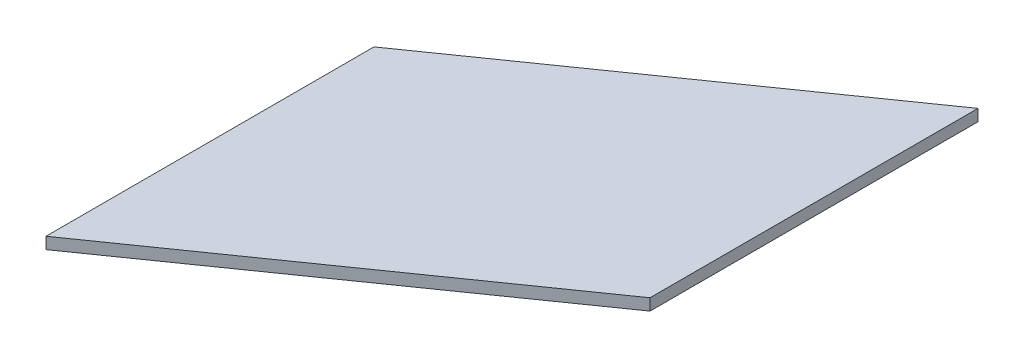
ISO-10303-21;
HEADER;
FILE_DESCRIPTION(('STEP AP214'),'2;1');
FILE_NAME('part.step','',(''),(''),'','','');
FILE_SCHEMA(('AUTOMOTIVE_DESIGN { 1 0 10303 214 1 1 1 1 }'));
ENDSEC;
DATA;
#1=APPLICATION_CONTEXT('core data for automotive mechanical design processes');
#2=APPLICATION_PROTOCOL_DEFINITION('international standard','automotive_design',2000,#1);
#3=PRODUCT_CONTEXT('',#1,'mechanical');
#4=PRODUCT('Part','Part','',(#3));
#5=PRODUCT_RELATED_PRODUCT_CATEGORY('part','',(#4));
#6=PRODUCT_DEFINITION_FORMATION('','',#4);
#7=PRODUCT_DEFINITION_CONTEXT('part definition',#1,'design');
#8=PRODUCT_DEFINITION('design','',#6,#7);
#9=PRODUCT_DEFINITION_SHAPE('','',#8);
#10=(LENGTH_UNIT() NAMED_UNIT(*) SI_UNIT(.MILLI.,.METRE.));
#11=(NAMED_UNIT(*) PLANE_ANGLE_UNIT() SI_UNIT($,.RADIAN.));
#12=(NAMED_UNIT(*) SI_UNIT($,.STERADIAN.) SOLID_ANGLE_UNIT());
#13=UNCERTAINTY_MEASURE_WITH_UNIT(LENGTH_MEASURE(1.E-05),#10,'distance_accuracy_value','');
#14=(GEOMETRIC_REPRESENTATION_CONTEXT(3) GLOBAL_UNCERTAINTY_ASSIGNED_CONTEXT((#13)) GLOBAL_UNIT_ASSIGNED_CONTEXT((#10,
#11,#12)) REPRESENTATION_CONTEXT('',''));
#15=CARTESIAN_POINT('',(0.,0.,0.));
#16=DIRECTION('',(0.,0.,1.));
#17=DIRECTION('',(1.,0.,0.));
#18=AXIS2_PLACEMENT_3D('',#15,#16,#17);
#19=CARTESIAN_POINT('',(0.,12.7,0.));
#20=DIRECTION('',(-0.573576436351042,0.,-0.819152044288995));
#21=DIRECTION('',(-0.819152044288995,0.,0.573576436351042));
#22=AXIS2_PLACEMENT_3D('',#19,#20,#21);
#23=PLANE('',#22);
#24=DIRECTION('',(0.819152044288995,0.,-0.573576436351042));
#25=VECTOR('',#24,1.);
#26=CARTESIAN_POINT('',(0.,0.,0.));
#27=LINE('',#26,#25);
#28=CARTESIAN_POINT('',(0.,0.,0.));
#29=VERTEX_POINT('',#28);
#30=CARTESIAN_POINT('',(388.9375,0.,-272.336969392436));
#31=VERTEX_POINT('',#30);
#32=EDGE_CURVE('E96',#29,#31,#27,.T.);
#33=ORIENTED_EDGE('',*,*,#32,.T.);
#34=DIRECTION('',(0.,-1.,0.));
#35=VECTOR('',#34,1.);
#36=CARTESIAN_POINT('',(388.9375,12.7,-272.336969392436));
#37=LINE('',#36,#35);
#38=CARTESIAN_POINT('',(388.9375,12.7,-272.336969392436));
#39=VERTEX_POINT('',#38);
#40=EDGE_CURVE('E11',#39,#31,#37,.T.);
#41=ORIENTED_EDGE('',*,*,#40,.F.);
#42=DIRECTION('',(0.819152044288995,0.,-0.573576436351042));
#43=VECTOR('',#42,1.);
#44=CARTESIAN_POINT('',(0.,12.7,0.));
#45=LINE('',#44,#43);
#46=CARTESIAN_POINT('',(0.,12.7,0.));
#47=VERTEX_POINT('',#46);
#48=EDGE_CURVE('E84',#47,#39,#45,.T.);
#49=ORIENTED_EDGE('',*,*,#48,.F.);
#50=DIRECTION('',(0.,-1.,0.));
#51=VECTOR('',#50,1.);
#52=CARTESIAN_POINT('',(0.,12.7,0.));
#53=LINE('',#52,#51);
#54=EDGE_CURVE('E92',#47,#29,#53,.T.);
#55=ORIENTED_EDGE('',*,*,#54,.T.);
#56=EDGE_LOOP('',(#33,#41,#49,#55));
#57=FACE_BOUND('',#56,.T.);
#58=ADVANCED_FACE('F33',(#57),#23,.F.);
#59=CARTESIAN_POINT('',(388.9375,12.7,-272.336969392436));
#60=DIRECTION('',(-1.,0.,0.));
#61=DIRECTION('',(0.,0.,1.));
#62=AXIS2_PLACEMENT_3D('',#59,#60,#61);
#63=PLANE('',#62);
#64=DIRECTION('',(0.,0.,-1.));
#65=VECTOR('',#64,1.);
#66=CARTESIAN_POINT('',(388.9375,0.,-272.336969392436));
#67=LINE('',#66,#65);
#68=CARTESIAN_POINT('',(388.9375,0.,-631.400399862883));
#69=VERTEX_POINT('',#68);
#70=EDGE_CURVE('E88',#31,#69,#67,.T.);
#71=ORIENTED_EDGE('',*,*,#70,.T.);
#72=DIRECTION('',(0.,-1.,0.));
#73=VECTOR('',#72,1.);
#74=CARTESIAN_POINT('',(388.9375,12.7,-631.400399862883));
#75=LINE('',#74,#73);
#76=CARTESIAN_POINT('',(388.9375,12.7,-631.400399862883));
#77=VERTEX_POINT('',#76);
#78=EDGE_CURVE('E41',#77,#69,#75,.T.);
#79=ORIENTED_EDGE('',*,*,#78,.F.);
#80=DIRECTION('',(0.,0.,-1.));
#81=VECTOR('',#80,1.);
#82=CARTESIAN_POINT('',(388.9375,12.7,-272.336969392436));
#83=LINE('',#82,#81);
#84=EDGE_CURVE('E79',#39,#77,#83,.T.);
#85=ORIENTED_EDGE('',*,*,#84,.F.);
#86=ORIENTED_EDGE('',*,*,#40,.T.);
#87=EDGE_LOOP('',(#71,#79,#85,#86));
#88=FACE_BOUND('',#87,.T.);
#89=ADVANCED_FACE('F87',(#88),#63,.F.);
#90=CARTESIAN_POINT('',(0.,12.7,-359.063430470447));
#91=DIRECTION('',(0.573576436351042,0.,0.819152044288995));
#92=DIRECTION('',(0.819152044288995,0.,-0.573576436351042));
#93=AXIS2_PLACEMENT_3D('',#90,#91,#92);
#94=PLANE('',#93);
#95=DIRECTION('',(-0.819152044288995,0.,0.573576436351042));
#96=VECTOR('',#95,1.);
#97=CARTESIAN_POINT('',(0.,0.,-359.063430470447));
#98=LINE('',#97,#96);
#99=CARTESIAN_POINT('',(0.,0.,-359.063430470447));
#100=VERTEX_POINT('',#99);
#101=EDGE_CURVE('E66',#69,#100,#98,.T.);
#102=ORIENTED_EDGE('',*,*,#101,.T.);
#103=DIRECTION('',(0.,-1.,0.));
#104=VECTOR('',#103,1.);
#105=CARTESIAN_POINT('',(0.,12.7,-359.063430470447));
#106=LINE('',#105,#104);
#107=CARTESIAN_POINT('',(0.,12.7,-359.063430470447));
#108=VERTEX_POINT('',#107);
#109=EDGE_CURVE('E89',#108,#100,#106,.T.);
#110=ORIENTED_EDGE('',*,*,#109,.F.);
#111=DIRECTION('',(-0.819152044288995,0.,0.573576436351042));
#112=VECTOR('',#111,1.);
#113=CARTESIAN_POINT('',(0.,12.7,-359.063430470447));
#114=LINE('',#113,#112);
#115=EDGE_CURVE('E82',#77,#108,#114,.T.);
#116=ORIENTED_EDGE('',*,*,#115,.F.);
#117=ORIENTED_EDGE('',*,*,#78,.T.);
#118=EDGE_LOOP('',(#102,#110,#116,#117));
#119=FACE_BOUND('',#118,.T.);
#120=ADVANCED_FACE('F90',(#119),#94,.F.);
#121=CARTESIAN_POINT('',(0.,12.7,0.));
#122=DIRECTION('',(1.,0.,0.));
#123=DIRECTION('',(0.,0.,-1.));
#124=AXIS2_PLACEMENT_3D('',#121,#122,#123);
#125=PLANE('',#124);
#126=DIRECTION('',(0.,0.,1.));
#127=VECTOR('',#126,1.);
#128=CARTESIAN_POINT('',(0.,0.,0.));
#129=LINE('',#128,#127);
#130=EDGE_CURVE('E72',#100,#29,#129,.T.);
#131=ORIENTED_EDGE('',*,*,#130,.T.);
#132=ORIENTED_EDGE('',*,*,#54,.F.);
#133=DIRECTION('',(0.,0.,1.));
#134=VECTOR('',#133,1.);
#135=CARTESIAN_POINT('',(0.,12.7,0.));
#136=LINE('',#135,#134);
#137=EDGE_CURVE('E49',#108,#47,#136,.T.);
#138=ORIENTED_EDGE('',*,*,#137,.F.);
#139=ORIENTED_EDGE('',*,*,#109,.T.);
#140=EDGE_LOOP('',(#131,#132,#138,#139));
#141=FACE_BOUND('',#140,.T.);
#142=ADVANCED_FACE('F103',(#141),#125,.F.);
#143=CARTESIAN_POINT('',(0.,12.7,0.));
#144=DIRECTION('',(0.,1.,0.));
#145=DIRECTION('',(0.,0.,1.));
#146=AXIS2_PLACEMENT_3D('',#143,#144,#145);
#147=PLANE('',#146);
#148=ORIENTED_EDGE('',*,*,#48,.T.);
#149=ORIENTED_EDGE('',*,*,#84,.T.);
#150=ORIENTED_EDGE('',*,*,#115,.T.);
#151=ORIENTED_EDGE('',*,*,#137,.T.);
#152=EDGE_LOOP('',(#148,#149,#150,#151));
#153=FACE_BOUND('',#152,.T.);
#154=ADVANCED_FACE('F80',(#153),#147,.T.);
#155=CARTESIAN_POINT('',(0.,0.,0.));
#156=DIRECTION('',(0.,1.,0.));
#157=DIRECTION('',(0.,0.,1.));
#158=AXIS2_PLACEMENT_3D('',#155,#156,#157);
#159=PLANE('',#158);
#160=ORIENTED_EDGE('',*,*,#32,.F.);
#161=ORIENTED_EDGE('',*,*,#130,.F.);
#162=ORIENTED_EDGE('',*,*,#101,.F.);
#163=ORIENTED_EDGE('',*,*,#70,.F.);
#164=EDGE_LOOP('',(#160,#161,#162,#163));
#165=FACE_BOUND('',#164,.T.);
#166=ADVANCED_FACE('F106',(#165),#159,.F.);
#167=CLOSED_SHELL('',(#58,#89,#120,#142,#154,#166));
#168=MANIFOLD_SOLID_BREP('B2',#167);
#169=ADVANCED_BREP_SHAPE_REPRESENTATION('',(#18,#168),#14);
#170=SHAPE_DEFINITION_REPRESENTATION(#9,#169);
ENDSEC;
END-ISO-10303-21;
